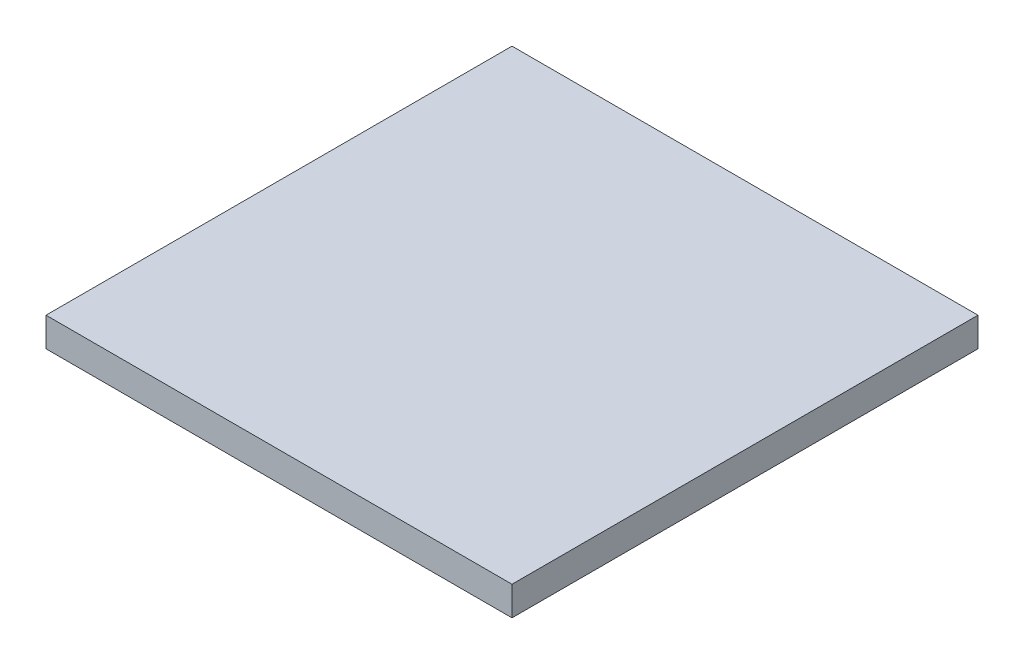
ISO-10303-21;
HEADER;
FILE_DESCRIPTION(('STEP AP214'),'2;1');
FILE_NAME('part.step','',(''),(''),'','','');
FILE_SCHEMA(('AUTOMOTIVE_DESIGN { 1 0 10303 214 1 1 1 1 }'));
ENDSEC;
DATA;
#1=APPLICATION_CONTEXT('core data for automotive mechanical design processes');
#2=APPLICATION_PROTOCOL_DEFINITION('international standard','automotive_design',2000,#1);
#3=PRODUCT_CONTEXT('',#1,'mechanical');
#4=PRODUCT('Part','Part','',(#3));
#5=PRODUCT_RELATED_PRODUCT_CATEGORY('part','',(#4));
#6=PRODUCT_DEFINITION_FORMATION('','',#4);
#7=PRODUCT_DEFINITION_CONTEXT('part definition',#1,'design');
#8=PRODUCT_DEFINITION('design','',#6,#7);
#9=PRODUCT_DEFINITION_SHAPE('','',#8);
#10=(LENGTH_UNIT() NAMED_UNIT(*) SI_UNIT(.MILLI.,.METRE.));
#11=(NAMED_UNIT(*) PLANE_ANGLE_UNIT() SI_UNIT($,.RADIAN.));
#12=(NAMED_UNIT(*) SI_UNIT($,.STERADIAN.) SOLID_ANGLE_UNIT());
#13=UNCERTAINTY_MEASURE_WITH_UNIT(LENGTH_MEASURE(1.E-05),#10,'distance_accuracy_value','');
#14=(GEOMETRIC_REPRESENTATION_CONTEXT(3) GLOBAL_UNCERTAINTY_ASSIGNED_CONTEXT((#13)) GLOBAL_UNIT_ASSIGNED_CONTEXT((#10,
#11,#12)) REPRESENTATION_CONTEXT('',''));
#15=CARTESIAN_POINT('',(0.,0.,0.));
#16=DIRECTION('',(0.,0.,1.));
#17=DIRECTION('',(1.,0.,0.));
#18=AXIS2_PLACEMENT_3D('',#15,#16,#17);
#19=CARTESIAN_POINT('',(101.6,12.7,101.6));
#20=DIRECTION('',(-1.,0.,0.));
#21=DIRECTION('',(0.,0.,1.));
#22=AXIS2_PLACEMENT_3D('',#19,#20,#21);
#23=PLANE('',#22);
#24=DIRECTION('',(0.,0.,-1.));
#25=VECTOR('',#24,1.);
#26=CARTESIAN_POINT('',(101.6,0.,101.6));
#27=LINE('',#26,#25);
#28=CARTESIAN_POINT('',(101.6,0.,101.6));
#29=VERTEX_POINT('',#28);
#30=CARTESIAN_POINT('',(101.6,0.,-101.6));
#31=VERTEX_POINT('',#30);
#32=EDGE_CURVE('E113',#29,#31,#27,.T.);
#33=ORIENTED_EDGE('',*,*,#32,.T.);
#34=DIRECTION('',(0.,-1.,0.));
#35=VECTOR('',#34,1.);
#36=CARTESIAN_POINT('',(101.6,12.7,-101.6));
#37=LINE('',#36,#35);
#38=CARTESIAN_POINT('',(101.6,12.7,-101.6));
#39=VERTEX_POINT('',#38);
#40=EDGE_CURVE('E11',#39,#31,#37,.T.);
#41=ORIENTED_EDGE('',*,*,#40,.F.);
#42=DIRECTION('',(0.,0.,-1.));
#43=VECTOR('',#42,1.);
#44=CARTESIAN_POINT('',(101.6,12.7,101.6));
#45=LINE('',#44,#43);
#46=CARTESIAN_POINT('',(101.6,12.7,101.6));
#47=VERTEX_POINT('',#46);
#48=EDGE_CURVE('E97',#47,#39,#45,.T.);
#49=ORIENTED_EDGE('',*,*,#48,.F.);
#50=DIRECTION('',(0.,-1.,0.));
#51=VECTOR('',#50,1.);
#52=CARTESIAN_POINT('',(101.6,12.7,101.6));
#53=LINE('',#52,#51);
#54=EDGE_CURVE('E109',#47,#29,#53,.T.);
#55=ORIENTED_EDGE('',*,*,#54,.T.);
#56=EDGE_LOOP('',(#33,#41,#49,#55));
#57=FACE_BOUND('',#56,.T.);
#58=ADVANCED_FACE('F45',(#57),#23,.F.);
#59=CARTESIAN_POINT('',(-101.6,12.7,-101.6));
#60=DIRECTION('',(0.,0.,1.));
#61=DIRECTION('',(1.,0.,0.));
#62=AXIS2_PLACEMENT_3D('',#59,#60,#61);
#63=PLANE('',#62);
#64=DIRECTION('',(-1.,0.,0.));
#65=VECTOR('',#64,1.);
#66=CARTESIAN_POINT('',(-101.6,0.,-101.6));
#67=LINE('',#66,#65);
#68=CARTESIAN_POINT('',(-101.6,0.,-101.6));
#69=VERTEX_POINT('',#68);
#70=EDGE_CURVE('E102',#31,#69,#67,.T.);
#71=ORIENTED_EDGE('',*,*,#70,.T.);
#72=DIRECTION('',(0.,-1.,0.));
#73=VECTOR('',#72,1.);
#74=CARTESIAN_POINT('',(-101.6,12.7,-101.6));
#75=LINE('',#74,#73);
#76=CARTESIAN_POINT('',(-101.6,12.7,-101.6));
#77=VERTEX_POINT('',#76);
#78=EDGE_CURVE('E54',#77,#69,#75,.T.);
#79=ORIENTED_EDGE('',*,*,#78,.F.);
#80=DIRECTION('',(-1.,0.,0.));
#81=VECTOR('',#80,1.);
#82=CARTESIAN_POINT('',(-101.6,12.7,-101.6));
#83=LINE('',#82,#81);
#84=EDGE_CURVE('E92',#39,#77,#83,.T.);
#85=ORIENTED_EDGE('',*,*,#84,.F.);
#86=ORIENTED_EDGE('',*,*,#40,.T.);
#87=EDGE_LOOP('',(#71,#79,#85,#86));
#88=FACE_BOUND('',#87,.T.);
#89=ADVANCED_FACE('F101',(#88),#63,.F.);
#90=CARTESIAN_POINT('',(-101.6,12.7,101.6));
#91=DIRECTION('',(1.,0.,0.));
#92=DIRECTION('',(0.,0.,-1.));
#93=AXIS2_PLACEMENT_3D('',#90,#91,#92);
#94=PLANE('',#93);
#95=DIRECTION('',(0.,0.,1.));
#96=VECTOR('',#95,1.);
#97=CARTESIAN_POINT('',(-101.6,0.,101.6));
#98=LINE('',#97,#96);
#99=CARTESIAN_POINT('',(-101.6,0.,101.6));
#100=VERTEX_POINT('',#99);
#101=EDGE_CURVE('E79',#69,#100,#98,.T.);
#102=ORIENTED_EDGE('',*,*,#101,.T.);
#103=DIRECTION('',(0.,-1.,0.));
#104=VECTOR('',#103,1.);
#105=CARTESIAN_POINT('',(-101.6,12.7,101.6));
#106=LINE('',#105,#104);
#107=CARTESIAN_POINT('',(-101.6,12.7,101.6));
#108=VERTEX_POINT('',#107);
#109=EDGE_CURVE('E104',#108,#100,#106,.T.);
#110=ORIENTED_EDGE('',*,*,#109,.F.);
#111=DIRECTION('',(0.,0.,1.));
#112=VECTOR('',#111,1.);
#113=CARTESIAN_POINT('',(-101.6,12.7,101.6));
#114=LINE('',#113,#112);
#115=EDGE_CURVE('E95',#77,#108,#114,.T.);
#116=ORIENTED_EDGE('',*,*,#115,.F.);
#117=ORIENTED_EDGE('',*,*,#78,.T.);
#118=EDGE_LOOP('',(#102,#110,#116,#117));
#119=FACE_BOUND('',#118,.T.);
#120=ADVANCED_FACE('F105',(#119),#94,.F.);
#121=CARTESIAN_POINT('',(-101.6,12.7,101.6));
#122=DIRECTION('',(0.,0.,-1.));
#123=DIRECTION('',(-1.,0.,0.));
#124=AXIS2_PLACEMENT_3D('',#121,#122,#123);
#125=PLANE('',#124);
#126=DIRECTION('',(1.,0.,0.));
#127=VECTOR('',#126,1.);
#128=CARTESIAN_POINT('',(-101.6,0.,101.6));
#129=LINE('',#128,#127);
#130=EDGE_CURVE('E85',#100,#29,#129,.T.);
#131=ORIENTED_EDGE('',*,*,#130,.T.);
#132=ORIENTED_EDGE('',*,*,#54,.F.);
#133=DIRECTION('',(1.,0.,0.));
#134=VECTOR('',#133,1.);
#135=CARTESIAN_POINT('',(-101.6,12.7,101.6));
#136=LINE('',#135,#134);
#137=EDGE_CURVE('E62',#108,#47,#136,.T.);
#138=ORIENTED_EDGE('',*,*,#137,.F.);
#139=ORIENTED_EDGE('',*,*,#109,.T.);
#140=EDGE_LOOP('',(#131,#132,#138,#139));
#141=FACE_BOUND('',#140,.T.);
#142=ADVANCED_FACE('F126',(#141),#125,.F.);
#143=CARTESIAN_POINT('',(0.,12.7,0.));
#144=DIRECTION('',(0.,-1.,0.));
#145=DIRECTION('',(0.,0.,-1.));
#146=AXIS2_PLACEMENT_3D('',#143,#144,#145);
#147=PLANE('',#146);
#148=ORIENTED_EDGE('',*,*,#48,.T.);
#149=ORIENTED_EDGE('',*,*,#84,.T.);
#150=ORIENTED_EDGE('',*,*,#115,.T.);
#151=ORIENTED_EDGE('',*,*,#137,.T.);
#152=EDGE_LOOP('',(#148,#149,#150,#151));
#153=FACE_BOUND('',#152,.T.);
#154=ADVANCED_FACE('F93',(#153),#147,.F.);
#155=CARTESIAN_POINT('',(0.,0.,0.));
#156=DIRECTION('',(0.,-1.,0.));
#157=DIRECTION('',(0.,0.,-1.));
#158=AXIS2_PLACEMENT_3D('',#155,#156,#157);
#159=PLANE('',#158);
#160=ORIENTED_EDGE('',*,*,#32,.F.);
#161=ORIENTED_EDGE('',*,*,#130,.F.);
#162=ORIENTED_EDGE('',*,*,#101,.F.);
#163=ORIENTED_EDGE('',*,*,#70,.F.);
#164=EDGE_LOOP('',(#160,#161,#162,#163));
#165=FACE_BOUND('',#164,.T.);
#166=ADVANCED_FACE('F129',(#165),#159,.T.);
#167=CLOSED_SHELL('',(#58,#89,#120,#142,#154,#166));
#168=MANIFOLD_SOLID_BREP('B2',#167);
#169=ADVANCED_BREP_SHAPE_REPRESENTATION('',(#18,#168),#14);
#170=SHAPE_DEFINITION_REPRESENTATION(#9,#169);
ENDSEC;
END-ISO-10303-21;
